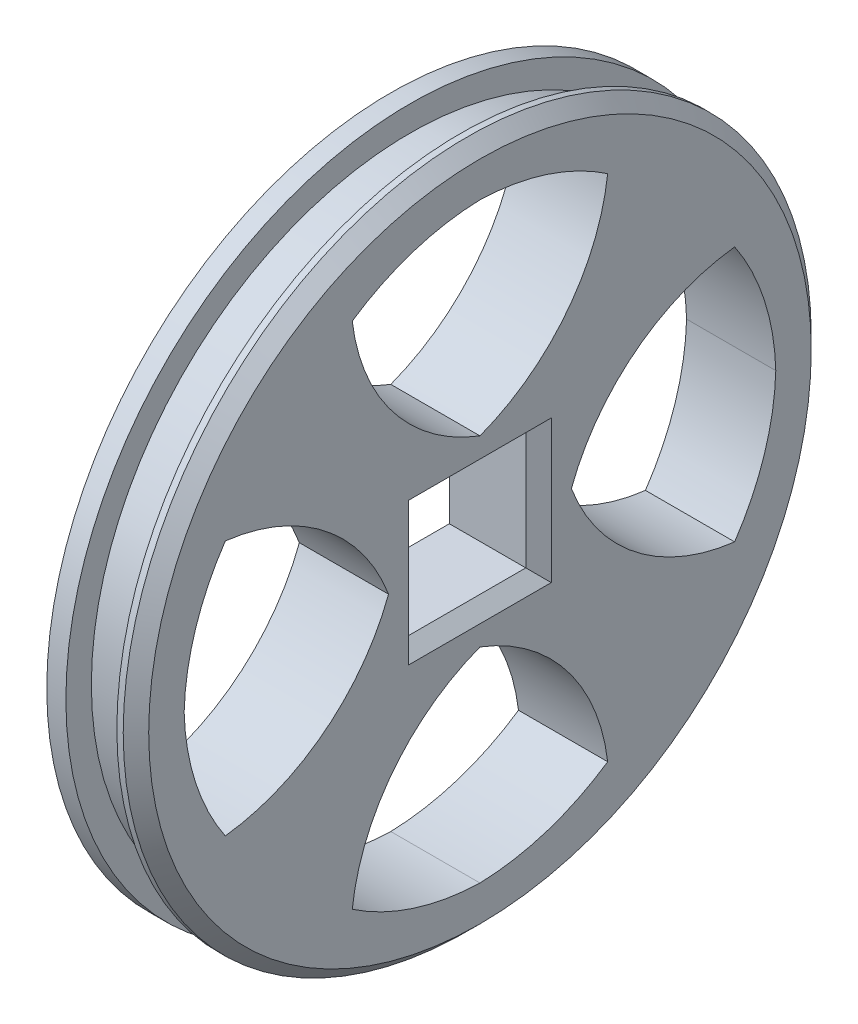
ISO-10303-21;
HEADER;
FILE_DESCRIPTION(('STEP AP214'),'2;1');
FILE_NAME('part.step','',(''),(''),'','','');
FILE_SCHEMA(('AUTOMOTIVE_DESIGN { 1 0 10303 214 1 1 1 1 }'));
ENDSEC;
DATA;
#1=APPLICATION_CONTEXT('core data for automotive mechanical design processes');
#2=APPLICATION_PROTOCOL_DEFINITION('international standard','automotive_design',2000,#1);
#3=PRODUCT_CONTEXT('',#1,'mechanical');
#4=PRODUCT('Part','Part','',(#3));
#5=PRODUCT_RELATED_PRODUCT_CATEGORY('part','',(#4));
#6=PRODUCT_DEFINITION_FORMATION('','',#4);
#7=PRODUCT_DEFINITION_CONTEXT('part definition',#1,'design');
#8=PRODUCT_DEFINITION('design','',#6,#7);
#9=PRODUCT_DEFINITION_SHAPE('','',#8);
#10=(LENGTH_UNIT() NAMED_UNIT(*) SI_UNIT(.MILLI.,.METRE.));
#11=(NAMED_UNIT(*) PLANE_ANGLE_UNIT() SI_UNIT($,.RADIAN.));
#12=(NAMED_UNIT(*) SI_UNIT($,.STERADIAN.) SOLID_ANGLE_UNIT());
#13=UNCERTAINTY_MEASURE_WITH_UNIT(LENGTH_MEASURE(1.E-05),#10,'distance_accuracy_value','');
#14=(GEOMETRIC_REPRESENTATION_CONTEXT(3) GLOBAL_UNCERTAINTY_ASSIGNED_CONTEXT((#13)) GLOBAL_UNIT_ASSIGNED_CONTEXT((#10,
#11,#12)) REPRESENTATION_CONTEXT('',''));
#15=CARTESIAN_POINT('',(0.,0.,0.));
#16=DIRECTION('',(0.,0.,1.));
#17=DIRECTION('',(1.,0.,0.));
#18=AXIS2_PLACEMENT_3D('',#15,#16,#17);
#19=CARTESIAN_POINT('',(1.75,0.,0.));
#20=DIRECTION('',(-1.,0.,0.));
#21=DIRECTION('',(0.,0.,1.));
#22=AXIS2_PLACEMENT_3D('',#19,#20,#21);
#23=CYLINDRICAL_SURFACE('',#22,13.5);
#24=CARTESIAN_POINT('',(-1.75,0.,0.));
#25=DIRECTION('',(1.,0.,0.));
#26=DIRECTION('',(0.,0.,-1.));
#27=AXIS2_PLACEMENT_3D('',#24,#25,#26);
#28=CIRCLE('',#27,13.5);
#29=CARTESIAN_POINT('',(-1.75,0.,-13.5));
#30=VERTEX_POINT('',#29);
#31=EDGE_CURVE('E343',#30,#30,#28,.T.);
#32=ORIENTED_EDGE('',*,*,#31,.T.);
#33=EDGE_LOOP('',(#32));
#34=FACE_BOUND('',#33,.T.);
#35=CARTESIAN_POINT('',(-1.,0.,0.));
#36=DIRECTION('',(1.,0.,0.));
#37=DIRECTION('',(0.,0.,-1.));
#38=AXIS2_PLACEMENT_3D('',#35,#36,#37);
#39=CIRCLE('',#38,13.5);
#40=CARTESIAN_POINT('',(-1.,0.,-13.5));
#41=VERTEX_POINT('',#40);
#42=EDGE_CURVE('E366',#41,#41,#39,.T.);
#43=ORIENTED_EDGE('',*,*,#42,.F.);
#44=EDGE_LOOP('',(#43));
#45=FACE_BOUND('',#44,.T.);
#46=ADVANCED_FACE('F35',(#34,#45),#23,.T.);
#47=CARTESIAN_POINT('',(1.75,0.,0.));
#48=DIRECTION('',(1.,0.,0.));
#49=DIRECTION('',(0.,0.,-1.));
#50=AXIS2_PLACEMENT_3D('',#47,#48,#49);
#51=PLANE('',#50);
#52=DIRECTION('',(0.,0.,1.));
#53=VECTOR('',#52,1.);
#54=CARTESIAN_POINT('',(1.75,-2.79809703885628,0.));
#55=LINE('',#54,#53);
#56=CARTESIAN_POINT('',(1.75,-2.79809703885628,-2.79809703885629));
#57=VERTEX_POINT('',#56);
#58=CARTESIAN_POINT('',(1.75,-2.79809703885628,2.79809703885628));
#59=VERTEX_POINT('',#58);
#60=EDGE_CURVE('E354',#57,#59,#55,.T.);
#61=ORIENTED_EDGE('',*,*,#60,.T.);
#62=DIRECTION('',(0.,1.,0.));
#63=VECTOR('',#62,1.);
#64=CARTESIAN_POINT('',(1.75,0.,2.79809703885628));
#65=LINE('',#64,#63);
#66=CARTESIAN_POINT('',(1.75,2.79809703885628,2.79809703885628));
#67=VERTEX_POINT('',#66);
#68=EDGE_CURVE('E356',#59,#67,#65,.T.);
#69=ORIENTED_EDGE('',*,*,#68,.T.);
#70=DIRECTION('',(0.,0.,-1.));
#71=VECTOR('',#70,1.);
#72=CARTESIAN_POINT('',(1.75,2.79809703885628,0.));
#73=LINE('',#72,#71);
#74=CARTESIAN_POINT('',(1.75,2.79809703885628,-2.79809703885629));
#75=VERTEX_POINT('',#74);
#76=EDGE_CURVE('E352',#67,#75,#73,.T.);
#77=ORIENTED_EDGE('',*,*,#76,.T.);
#78=DIRECTION('',(0.,-1.,0.));
#79=VECTOR('',#78,1.);
#80=CARTESIAN_POINT('',(1.75,0.,-2.79809703885629));
#81=LINE('',#80,#79);
#82=EDGE_CURVE('E350',#75,#57,#81,.T.);
#83=ORIENTED_EDGE('',*,*,#82,.T.);
#84=EDGE_LOOP('',(#61,#69,#77,#83));
#85=FACE_BOUND('',#84,.T.);
#86=CARTESIAN_POINT('',(1.75,0.,0.));
#87=DIRECTION('',(1.,0.,0.));
#88=DIRECTION('',(0.,0.,-1.));
#89=AXIS2_PLACEMENT_3D('',#86,#87,#88);
#90=CIRCLE('',#89,13.);
#91=CARTESIAN_POINT('',(1.75,0.,-13.));
#92=VERTEX_POINT('',#91);
#93=EDGE_CURVE('E347',#92,#92,#90,.T.);
#94=ORIENTED_EDGE('',*,*,#93,.T.);
#95=EDGE_LOOP('',(#94));
#96=FACE_BOUND('',#95,.T.);
#97=CARTESIAN_POINT('',(1.75,-2.21796156357521,-0.259109709954825));
#98=DIRECTION('',(1.,0.,0.));
#99=DIRECTION('',(0.,0.,1.));
#100=AXIS2_PLACEMENT_3D('',#97,#98,#99);
#101=CIRCLE('',#100,9.39432433543306);
#102=CARTESIAN_POINT('',(1.75,-9.99397715020798,5.01221946927066));
#103=VERTEX_POINT('',#102);
#104=CARTESIAN_POINT('',(1.75,-11.6087118998112,0.));
#105=VERTEX_POINT('',#104);
#106=EDGE_CURVE('E267',#103,#105,#101,.T.);
#107=ORIENTED_EDGE('',*,*,#106,.F.);
#108=CARTESIAN_POINT('',(1.75,-10.9187288878689,-2.77020242849163));
#109=DIRECTION('',(1.,0.,0.));
#110=DIRECTION('',(0.,0.,1.));
#111=AXIS2_PLACEMENT_3D('',#108,#109,#110);
#112=CIRCLE('',#111,7.8371714521935);
#113=CARTESIAN_POINT('',(1.75,-3.58747832086083,0.));
#114=VERTEX_POINT('',#113);
#115=EDGE_CURVE('E265',#114,#103,#112,.T.);
#116=ORIENTED_EDGE('',*,*,#115,.F.);
#117=CARTESIAN_POINT('',(1.75,-10.9187288878689,2.77020242849163));
#118=DIRECTION('',(1.,0.,0.));
#119=DIRECTION('',(0.,0.,-1.));
#120=AXIS2_PLACEMENT_3D('',#117,#118,#119);
#121=CIRCLE('',#120,7.8371714521935);
#122=CARTESIAN_POINT('',(1.75,-9.99397715020797,-5.01221946927065));
#123=VERTEX_POINT('',#122);
#124=EDGE_CURVE('E272',#123,#114,#121,.T.);
#125=ORIENTED_EDGE('',*,*,#124,.F.);
#126=CARTESIAN_POINT('',(1.75,-2.21796156357521,0.259109709954825));
#127=DIRECTION('',(1.,0.,0.));
#128=DIRECTION('',(0.,0.,-1.));
#129=AXIS2_PLACEMENT_3D('',#126,#127,#128);
#130=CIRCLE('',#129,9.39432433543306);
#131=EDGE_CURVE('E269',#105,#123,#130,.T.);
#132=ORIENTED_EDGE('',*,*,#131,.F.);
#133=EDGE_LOOP('',(#107,#116,#125,#132));
#134=FACE_BOUND('',#133,.T.);
#135=CARTESIAN_POINT('',(1.75,0.259109709954849,-2.2179615635752));
#136=DIRECTION('',(1.,0.,0.));
#137=DIRECTION('',(0.,-1.,0.));
#138=AXIS2_PLACEMENT_3D('',#135,#136,#137);
#139=CIRCLE('',#138,9.39432433543306);
#140=CARTESIAN_POINT('',(1.75,-5.01221946927055,-9.99397715020803));
#141=VERTEX_POINT('',#140);
#142=CARTESIAN_POINT('',(1.75,1.22028483767586E-13,-11.6087118998112));
#143=VERTEX_POINT('',#142);
#144=EDGE_CURVE('E237',#141,#143,#139,.T.);
#145=ORIENTED_EDGE('',*,*,#144,.F.);
#146=CARTESIAN_POINT('',(1.75,2.77020242849175,-10.9187288878689));
#147=DIRECTION('',(1.,0.,0.));
#148=DIRECTION('',(0.,-1.,0.));
#149=AXIS2_PLACEMENT_3D('',#146,#147,#148);
#150=CIRCLE('',#149,7.8371714521935);
#151=CARTESIAN_POINT('',(1.75,0.,-3.58747832086083));
#152=VERTEX_POINT('',#151);
#153=EDGE_CURVE('E235',#152,#141,#150,.T.);
#154=ORIENTED_EDGE('',*,*,#153,.F.);
#155=CARTESIAN_POINT('',(1.75,-2.77020242849152,-10.9187288878689));
#156=DIRECTION('',(1.,0.,0.));
#157=DIRECTION('',(0.,1.,0.));
#158=AXIS2_PLACEMENT_3D('',#155,#156,#157);
#159=CIRCLE('',#158,7.8371714521935);
#160=CARTESIAN_POINT('',(1.75,5.01221946927076,-9.99397715020792));
#161=VERTEX_POINT('',#160);
#162=EDGE_CURVE('E242',#161,#152,#159,.T.);
#163=ORIENTED_EDGE('',*,*,#162,.F.);
#164=CARTESIAN_POINT('',(1.75,-0.259109709954802,-2.21796156357521));
#165=DIRECTION('',(1.,0.,0.));
#166=DIRECTION('',(0.,1.,0.));
#167=AXIS2_PLACEMENT_3D('',#164,#165,#166);
#168=CIRCLE('',#167,9.39432433543306);
#169=EDGE_CURVE('E239',#143,#161,#168,.T.);
#170=ORIENTED_EDGE('',*,*,#169,.F.);
#171=EDGE_LOOP('',(#145,#154,#163,#170));
#172=FACE_BOUND('',#171,.T.);
#173=CARTESIAN_POINT('',(1.75,-0.259109709954833,2.2179615635752));
#174=DIRECTION('',(1.,0.,0.));
#175=DIRECTION('',(0.,1.,0.));
#176=AXIS2_PLACEMENT_3D('',#173,#174,#175);
#177=CIRCLE('',#176,9.39432433543306);
#178=CARTESIAN_POINT('',(1.75,5.01221946927062,9.99397715020799));
#179=VERTEX_POINT('',#178);
#180=CARTESIAN_POINT('',(1.75,0.,11.6087118998112));
#181=VERTEX_POINT('',#180);
#182=EDGE_CURVE('E297',#179,#181,#177,.T.);
#183=ORIENTED_EDGE('',*,*,#182,.F.);
#184=CARTESIAN_POINT('',(1.75,-2.77020242849167,10.9187288878689));
#185=DIRECTION('',(1.,0.,0.));
#186=DIRECTION('',(0.,1.,0.));
#187=AXIS2_PLACEMENT_3D('',#184,#185,#186);
#188=CIRCLE('',#187,7.8371714521935);
#189=CARTESIAN_POINT('',(1.75,0.,3.58747832086083));
#190=VERTEX_POINT('',#189);
#191=EDGE_CURVE('E295',#190,#179,#188,.T.);
#192=ORIENTED_EDGE('',*,*,#191,.F.);
#193=CARTESIAN_POINT('',(1.75,2.77020242849159,10.9187288878689));
#194=DIRECTION('',(1.,0.,0.));
#195=DIRECTION('',(0.,-1.,0.));
#196=AXIS2_PLACEMENT_3D('',#193,#194,#195);
#197=CIRCLE('',#196,7.8371714521935);
#198=CARTESIAN_POINT('',(1.75,-5.01221946927069,9.99397715020795));
#199=VERTEX_POINT('',#198);
#200=EDGE_CURVE('E302',#199,#190,#197,.T.);
#201=ORIENTED_EDGE('',*,*,#200,.F.);
#202=CARTESIAN_POINT('',(1.75,0.259109709954818,2.21796156357521));
#203=DIRECTION('',(1.,0.,0.));
#204=DIRECTION('',(0.,-1.,0.));
#205=AXIS2_PLACEMENT_3D('',#202,#203,#204);
#206=CIRCLE('',#205,9.39432433543306);
#207=EDGE_CURVE('E299',#181,#199,#206,.T.);
#208=ORIENTED_EDGE('',*,*,#207,.F.);
#209=EDGE_LOOP('',(#183,#192,#201,#208));
#210=FACE_BOUND('',#209,.T.);
#211=CARTESIAN_POINT('',(1.75,2.21796156357521,0.259109709954825));
#212=DIRECTION('',(1.,0.,0.));
#213=DIRECTION('',(0.,0.,-1.));
#214=AXIS2_PLACEMENT_3D('',#211,#212,#213);
#215=CIRCLE('',#214,9.39432433543306);
#216=CARTESIAN_POINT('',(1.75,9.99397715020798,-5.01221946927066));
#217=VERTEX_POINT('',#216);
#218=CARTESIAN_POINT('',(1.75,11.6087118998112,0.));
#219=VERTEX_POINT('',#218);
#220=EDGE_CURVE('E327',#217,#219,#215,.T.);
#221=ORIENTED_EDGE('',*,*,#220,.F.);
#222=CARTESIAN_POINT('',(1.75,10.9187288878689,2.77020242849163));
#223=DIRECTION('',(1.,0.,0.));
#224=DIRECTION('',(0.,0.,-1.));
#225=AXIS2_PLACEMENT_3D('',#222,#223,#224);
#226=CIRCLE('',#225,7.8371714521935);
#227=CARTESIAN_POINT('',(1.75,3.58747832086083,0.));
#228=VERTEX_POINT('',#227);
#229=EDGE_CURVE('E325',#228,#217,#226,.T.);
#230=ORIENTED_EDGE('',*,*,#229,.F.);
#231=CARTESIAN_POINT('',(1.75,10.9187288878689,-2.77020242849163));
#232=DIRECTION('',(1.,0.,0.));
#233=DIRECTION('',(0.,0.,1.));
#234=AXIS2_PLACEMENT_3D('',#231,#232,#233);
#235=CIRCLE('',#234,7.8371714521935);
#236=CARTESIAN_POINT('',(1.75,9.99397715020797,5.01221946927065));
#237=VERTEX_POINT('',#236);
#238=EDGE_CURVE('E332',#237,#228,#235,.T.);
#239=ORIENTED_EDGE('',*,*,#238,.F.);
#240=CARTESIAN_POINT('',(1.75,2.21796156357521,-0.259109709954825));
#241=DIRECTION('',(1.,0.,0.));
#242=DIRECTION('',(0.,0.,1.));
#243=AXIS2_PLACEMENT_3D('',#240,#241,#242);
#244=CIRCLE('',#243,9.39432433543306);
#245=EDGE_CURVE('E329',#219,#237,#244,.T.);
#246=ORIENTED_EDGE('',*,*,#245,.F.);
#247=EDGE_LOOP('',(#221,#230,#239,#246));
#248=FACE_BOUND('',#247,.T.);
#249=ADVANCED_FACE('F394',(#85,#96,#134,#172,#210,#248),#51,.T.);
#250=CARTESIAN_POINT('',(-1.75,0.,0.));
#251=DIRECTION('',(1.,0.,0.));
#252=DIRECTION('',(0.,0.,-1.));
#253=AXIS2_PLACEMENT_3D('',#250,#251,#252);
#254=PLANE('',#253);
#255=ORIENTED_EDGE('',*,*,#31,.F.);
#256=EDGE_LOOP('',(#255));
#257=FACE_BOUND('',#256,.T.);
#258=CARTESIAN_POINT('',(-1.75,10.9187288878689,2.77020242849163));
#259=DIRECTION('',(1.,0.,0.));
#260=DIRECTION('',(0.,0.,-1.));
#261=AXIS2_PLACEMENT_3D('',#258,#259,#260);
#262=CIRCLE('',#261,7.8371714521935);
#263=CARTESIAN_POINT('',(-1.75,3.58747832086083,0.));
#264=VERTEX_POINT('',#263);
#265=CARTESIAN_POINT('',(-1.75,9.99397715020798,-5.01221946927066));
#266=VERTEX_POINT('',#265);
#267=EDGE_CURVE('E313',#264,#266,#262,.T.);
#268=ORIENTED_EDGE('',*,*,#267,.T.);
#269=CARTESIAN_POINT('',(-1.75,2.21796156357521,0.259109709954825));
#270=DIRECTION('',(1.,0.,0.));
#271=DIRECTION('',(0.,0.,-1.));
#272=AXIS2_PLACEMENT_3D('',#269,#270,#271);
#273=CIRCLE('',#272,9.39432433543306);
#274=CARTESIAN_POINT('',(-1.75,11.6087118998112,0.));
#275=VERTEX_POINT('',#274);
#276=EDGE_CURVE('E316',#266,#275,#273,.T.);
#277=ORIENTED_EDGE('',*,*,#276,.T.);
#278=CARTESIAN_POINT('',(-1.75,2.21796156357521,-0.259109709954825));
#279=DIRECTION('',(1.,0.,0.));
#280=DIRECTION('',(0.,0.,1.));
#281=AXIS2_PLACEMENT_3D('',#278,#279,#280);
#282=CIRCLE('',#281,9.39432433543306);
#283=CARTESIAN_POINT('',(-1.75,9.99397715020797,5.01221946927065));
#284=VERTEX_POINT('',#283);
#285=EDGE_CURVE('E319',#275,#284,#282,.T.);
#286=ORIENTED_EDGE('',*,*,#285,.T.);
#287=CARTESIAN_POINT('',(-1.75,10.9187288878689,-2.77020242849163));
#288=DIRECTION('',(1.,0.,0.));
#289=DIRECTION('',(0.,0.,1.));
#290=AXIS2_PLACEMENT_3D('',#287,#288,#289);
#291=CIRCLE('',#290,7.8371714521935);
#292=EDGE_CURVE('E322',#284,#264,#291,.T.);
#293=ORIENTED_EDGE('',*,*,#292,.T.);
#294=EDGE_LOOP('',(#268,#277,#286,#293));
#295=FACE_BOUND('',#294,.T.);
#296=CARTESIAN_POINT('',(-1.75,-2.77020242849167,10.9187288878689));
#297=DIRECTION('',(1.,0.,0.));
#298=DIRECTION('',(0.,1.,0.));
#299=AXIS2_PLACEMENT_3D('',#296,#297,#298);
#300=CIRCLE('',#299,7.8371714521935);
#301=CARTESIAN_POINT('',(-1.75,0.,3.58747832086083));
#302=VERTEX_POINT('',#301);
#303=CARTESIAN_POINT('',(-1.75,5.01221946927062,9.99397715020799));
#304=VERTEX_POINT('',#303);
#305=EDGE_CURVE('E283',#302,#304,#300,.T.);
#306=ORIENTED_EDGE('',*,*,#305,.T.);
#307=CARTESIAN_POINT('',(-1.75,-0.259109709954833,2.2179615635752));
#308=DIRECTION('',(1.,0.,0.));
#309=DIRECTION('',(0.,1.,0.));
#310=AXIS2_PLACEMENT_3D('',#307,#308,#309);
#311=CIRCLE('',#310,9.39432433543306);
#312=CARTESIAN_POINT('',(-1.75,0.,11.6087118998112));
#313=VERTEX_POINT('',#312);
#314=EDGE_CURVE('E286',#304,#313,#311,.T.);
#315=ORIENTED_EDGE('',*,*,#314,.T.);
#316=CARTESIAN_POINT('',(-1.75,0.259109709954818,2.21796156357521));
#317=DIRECTION('',(1.,0.,0.));
#318=DIRECTION('',(0.,-1.,0.));
#319=AXIS2_PLACEMENT_3D('',#316,#317,#318);
#320=CIRCLE('',#319,9.39432433543306);
#321=CARTESIAN_POINT('',(-1.75,-5.01221946927069,9.99397715020795));
#322=VERTEX_POINT('',#321);
#323=EDGE_CURVE('E289',#313,#322,#320,.T.);
#324=ORIENTED_EDGE('',*,*,#323,.T.);
#325=CARTESIAN_POINT('',(-1.75,2.77020242849159,10.9187288878689));
#326=DIRECTION('',(1.,0.,0.));
#327=DIRECTION('',(0.,-1.,0.));
#328=AXIS2_PLACEMENT_3D('',#325,#326,#327);
#329=CIRCLE('',#328,7.8371714521935);
#330=EDGE_CURVE('E292',#322,#302,#329,.T.);
#331=ORIENTED_EDGE('',*,*,#330,.T.);
#332=EDGE_LOOP('',(#306,#315,#324,#331));
#333=FACE_BOUND('',#332,.T.);
#334=CARTESIAN_POINT('',(-1.75,2.77020242849175,-10.9187288878689));
#335=DIRECTION('',(1.,0.,0.));
#336=DIRECTION('',(0.,-1.,0.));
#337=AXIS2_PLACEMENT_3D('',#334,#335,#336);
#338=CIRCLE('',#337,7.8371714521935);
#339=CARTESIAN_POINT('',(-1.75,0.,-3.58747832086083));
#340=VERTEX_POINT('',#339);
#341=CARTESIAN_POINT('',(-1.75,-5.01221946927055,-9.99397715020803));
#342=VERTEX_POINT('',#341);
#343=EDGE_CURVE('E196',#340,#342,#338,.T.);
#344=ORIENTED_EDGE('',*,*,#343,.T.);
#345=CARTESIAN_POINT('',(-1.75,0.259109709954849,-2.2179615635752));
#346=DIRECTION('',(1.,0.,0.));
#347=DIRECTION('',(0.,-1.,0.));
#348=AXIS2_PLACEMENT_3D('',#345,#346,#347);
#349=CIRCLE('',#348,9.39432433543306);
#350=CARTESIAN_POINT('',(-1.75,1.22028483767586E-13,-11.6087118998112));
#351=VERTEX_POINT('',#350);
#352=EDGE_CURVE('E226',#342,#351,#349,.T.);
#353=ORIENTED_EDGE('',*,*,#352,.T.);
#354=CARTESIAN_POINT('',(-1.75,-0.259109709954802,-2.21796156357521));
#355=DIRECTION('',(1.,0.,0.));
#356=DIRECTION('',(0.,1.,0.));
#357=AXIS2_PLACEMENT_3D('',#354,#355,#356);
#358=CIRCLE('',#357,9.39432433543306);
#359=CARTESIAN_POINT('',(-1.75,5.01221946927076,-9.99397715020792));
#360=VERTEX_POINT('',#359);
#361=EDGE_CURVE('E229',#351,#360,#358,.T.);
#362=ORIENTED_EDGE('',*,*,#361,.T.);
#363=CARTESIAN_POINT('',(-1.75,-2.77020242849152,-10.9187288878689));
#364=DIRECTION('',(1.,0.,0.));
#365=DIRECTION('',(0.,1.,0.));
#366=AXIS2_PLACEMENT_3D('',#363,#364,#365);
#367=CIRCLE('',#366,7.8371714521935);
#368=EDGE_CURVE('E232',#360,#340,#367,.T.);
#369=ORIENTED_EDGE('',*,*,#368,.T.);
#370=EDGE_LOOP('',(#344,#353,#362,#369));
#371=FACE_BOUND('',#370,.T.);
#372=CARTESIAN_POINT('',(-1.75,-10.9187288878689,-2.77020242849163));
#373=DIRECTION('',(1.,0.,0.));
#374=DIRECTION('',(0.,0.,1.));
#375=AXIS2_PLACEMENT_3D('',#372,#373,#374);
#376=CIRCLE('',#375,7.8371714521935);
#377=CARTESIAN_POINT('',(-1.75,-3.58747832086083,0.));
#378=VERTEX_POINT('',#377);
#379=CARTESIAN_POINT('',(-1.75,-9.99397715020798,5.01221946927066));
#380=VERTEX_POINT('',#379);
#381=EDGE_CURVE('E253',#378,#380,#376,.T.);
#382=ORIENTED_EDGE('',*,*,#381,.T.);
#383=CARTESIAN_POINT('',(-1.75,-2.21796156357521,-0.259109709954825));
#384=DIRECTION('',(1.,0.,0.));
#385=DIRECTION('',(0.,0.,1.));
#386=AXIS2_PLACEMENT_3D('',#383,#384,#385);
#387=CIRCLE('',#386,9.39432433543306);
#388=CARTESIAN_POINT('',(-1.75,-11.6087118998112,0.));
#389=VERTEX_POINT('',#388);
#390=EDGE_CURVE('E256',#380,#389,#387,.T.);
#391=ORIENTED_EDGE('',*,*,#390,.T.);
#392=CARTESIAN_POINT('',(-1.75,-2.21796156357521,0.259109709954825));
#393=DIRECTION('',(1.,0.,0.));
#394=DIRECTION('',(0.,0.,-1.));
#395=AXIS2_PLACEMENT_3D('',#392,#393,#394);
#396=CIRCLE('',#395,9.39432433543306);
#397=CARTESIAN_POINT('',(-1.75,-9.99397715020797,-5.01221946927065));
#398=VERTEX_POINT('',#397);
#399=EDGE_CURVE('E259',#389,#398,#396,.T.);
#400=ORIENTED_EDGE('',*,*,#399,.T.);
#401=CARTESIAN_POINT('',(-1.75,-10.9187288878689,2.77020242849163));
#402=DIRECTION('',(1.,0.,0.));
#403=DIRECTION('',(0.,0.,-1.));
#404=AXIS2_PLACEMENT_3D('',#401,#402,#403);
#405=CIRCLE('',#404,7.8371714521935);
#406=EDGE_CURVE('E262',#398,#378,#405,.T.);
#407=ORIENTED_EDGE('',*,*,#406,.T.);
#408=EDGE_LOOP('',(#382,#391,#400,#407));
#409=FACE_BOUND('',#408,.T.);
#410=DIRECTION('',(0.,-1.,0.));
#411=VECTOR('',#410,1.);
#412=CARTESIAN_POINT('',(-1.75,-2.29809703885628,2.29809703885628));
#413=LINE('',#412,#411);
#414=CARTESIAN_POINT('',(-1.75,2.29809703885628,2.29809703885628));
#415=VERTEX_POINT('',#414);
#416=CARTESIAN_POINT('',(-1.75,-2.29809703885628,2.29809703885628));
#417=VERTEX_POINT('',#416);
#418=EDGE_CURVE('E192',#415,#417,#413,.T.);
#419=ORIENTED_EDGE('',*,*,#418,.T.);
#420=DIRECTION('',(0.,0.,-1.));
#421=VECTOR('',#420,1.);
#422=CARTESIAN_POINT('',(-1.75,-2.29809703885628,-2.29809703885628));
#423=LINE('',#422,#421);
#424=CARTESIAN_POINT('',(-1.75,-2.29809703885628,-2.29809703885628));
#425=VERTEX_POINT('',#424);
#426=EDGE_CURVE('E200',#417,#425,#423,.T.);
#427=ORIENTED_EDGE('',*,*,#426,.T.);
#428=DIRECTION('',(0.,1.,0.));
#429=VECTOR('',#428,1.);
#430=CARTESIAN_POINT('',(-1.75,-2.29809703885628,-2.29809703885628));
#431=LINE('',#430,#429);
#432=CARTESIAN_POINT('',(-1.75,2.29809703885628,-2.29809703885628));
#433=VERTEX_POINT('',#432);
#434=EDGE_CURVE('E205',#425,#433,#431,.T.);
#435=ORIENTED_EDGE('',*,*,#434,.T.);
#436=DIRECTION('',(0.,0.,1.));
#437=VECTOR('',#436,1.);
#438=CARTESIAN_POINT('',(-1.75,2.29809703885628,-2.29809703885628));
#439=LINE('',#438,#437);
#440=EDGE_CURVE('E209',#433,#415,#439,.T.);
#441=ORIENTED_EDGE('',*,*,#440,.T.);
#442=EDGE_LOOP('',(#419,#427,#435,#441));
#443=FACE_BOUND('',#442,.T.);
#444=ADVANCED_FACE('F207',(#257,#295,#333,#371,#409,#443),#254,.F.);
#445=CARTESIAN_POINT('',(1.,0.,0.));
#446=DIRECTION('',(1.,0.,0.));
#447=DIRECTION('',(0.,0.,-1.));
#448=AXIS2_PLACEMENT_3D('',#445,#446,#447);
#449=CIRCLE('',#448,13.5);
#450=CARTESIAN_POINT('',(1.,0.,-13.5));
#451=VERTEX_POINT('',#450);
#452=EDGE_CURVE('E214',#451,#451,#449,.T.);
#453=ORIENTED_EDGE('',*,*,#452,.T.);
#454=EDGE_LOOP('',(#453));
#455=FACE_BOUND('',#454,.T.);
#456=CARTESIAN_POINT('',(1.24999999999999,0.,0.));
#457=DIRECTION('',(1.,0.,0.));
#458=DIRECTION('',(0.,0.,-1.));
#459=AXIS2_PLACEMENT_3D('',#456,#457,#458);
#460=CIRCLE('',#459,13.5);
#461=CARTESIAN_POINT('',(1.24999999999999,0.,-13.5));
#462=VERTEX_POINT('',#461);
#463=EDGE_CURVE('E11',#462,#462,#460,.F.);
#464=ORIENTED_EDGE('',*,*,#463,.T.);
#465=EDGE_LOOP('',(#464));
#466=FACE_BOUND('',#465,.T.);
#467=ADVANCED_FACE('F397',(#455,#466),#23,.T.);
#468=CARTESIAN_POINT('',(1.75,10.9187288878689,2.77020242849163));
#469=DIRECTION('',(-1.,0.,0.));
#470=DIRECTION('',(0.,0.,1.));
#471=AXIS2_PLACEMENT_3D('',#468,#469,#470);
#472=CYLINDRICAL_SURFACE('',#471,7.8371714521935);
#473=DIRECTION('',(-1.,0.,0.));
#474=VECTOR('',#473,1.);
#475=CARTESIAN_POINT('',(1.75,3.58747832086083,0.));
#476=LINE('',#475,#474);
#477=EDGE_CURVE('E334',#228,#264,#476,.T.);
#478=ORIENTED_EDGE('',*,*,#477,.F.);
#479=ORIENTED_EDGE('',*,*,#229,.T.);
#480=DIRECTION('',(-1.,0.,0.));
#481=VECTOR('',#480,1.);
#482=CARTESIAN_POINT('',(1.75,9.99397715020798,-5.01221946927066));
#483=LINE('',#482,#481);
#484=EDGE_CURVE('E341',#217,#266,#483,.T.);
#485=ORIENTED_EDGE('',*,*,#484,.T.);
#486=ORIENTED_EDGE('',*,*,#267,.F.);
#487=EDGE_LOOP('',(#478,#479,#485,#486));
#488=FACE_BOUND('',#487,.T.);
#489=ADVANCED_FACE('F407',(#488),#472,.F.);
#490=CARTESIAN_POINT('',(1.75,2.21796156357521,0.259109709954825));
#491=DIRECTION('',(-1.,0.,0.));
#492=DIRECTION('',(0.,0.,1.));
#493=AXIS2_PLACEMENT_3D('',#490,#491,#492);
#494=CYLINDRICAL_SURFACE('',#493,9.39432433543306);
#495=ORIENTED_EDGE('',*,*,#484,.F.);
#496=ORIENTED_EDGE('',*,*,#220,.T.);
#497=DIRECTION('',(-1.,0.,0.));
#498=VECTOR('',#497,1.);
#499=CARTESIAN_POINT('',(1.75,11.6087118998112,0.));
#500=LINE('',#499,#498);
#501=EDGE_CURVE('E339',#219,#275,#500,.T.);
#502=ORIENTED_EDGE('',*,*,#501,.T.);
#503=ORIENTED_EDGE('',*,*,#276,.F.);
#504=EDGE_LOOP('',(#495,#496,#502,#503));
#505=FACE_BOUND('',#504,.T.);
#506=ADVANCED_FACE('F413',(#505),#494,.F.);
#507=CARTESIAN_POINT('',(1.75,2.21796156357521,-0.259109709954825));
#508=DIRECTION('',(-1.,0.,0.));
#509=DIRECTION('',(0.,0.,1.));
#510=AXIS2_PLACEMENT_3D('',#507,#508,#509);
#511=CYLINDRICAL_SURFACE('',#510,9.39432433543306);
#512=ORIENTED_EDGE('',*,*,#501,.F.);
#513=ORIENTED_EDGE('',*,*,#245,.T.);
#514=DIRECTION('',(-1.,0.,0.));
#515=VECTOR('',#514,1.);
#516=CARTESIAN_POINT('',(1.75,9.99397715020797,5.01221946927065));
#517=LINE('',#516,#515);
#518=EDGE_CURVE('E337',#237,#284,#517,.T.);
#519=ORIENTED_EDGE('',*,*,#518,.T.);
#520=ORIENTED_EDGE('',*,*,#285,.F.);
#521=EDGE_LOOP('',(#512,#513,#519,#520));
#522=FACE_BOUND('',#521,.T.);
#523=ADVANCED_FACE('F451',(#522),#511,.F.);
#524=CARTESIAN_POINT('',(1.75,10.9187288878689,-2.77020242849163));
#525=DIRECTION('',(-1.,0.,0.));
#526=DIRECTION('',(0.,0.,1.));
#527=AXIS2_PLACEMENT_3D('',#524,#525,#526);
#528=CYLINDRICAL_SURFACE('',#527,7.8371714521935);
#529=ORIENTED_EDGE('',*,*,#518,.F.);
#530=ORIENTED_EDGE('',*,*,#238,.T.);
#531=ORIENTED_EDGE('',*,*,#477,.T.);
#532=ORIENTED_EDGE('',*,*,#292,.F.);
#533=EDGE_LOOP('',(#529,#530,#531,#532));
#534=FACE_BOUND('',#533,.T.);
#535=ADVANCED_FACE('F457',(#534),#528,.F.);
#536=CARTESIAN_POINT('',(1.75,-2.77020242849167,10.9187288878689));
#537=DIRECTION('',(-1.,0.,0.));
#538=DIRECTION('',(0.,0.,1.));
#539=AXIS2_PLACEMENT_3D('',#536,#537,#538);
#540=CYLINDRICAL_SURFACE('',#539,7.8371714521935);
#541=DIRECTION('',(-1.,0.,0.));
#542=VECTOR('',#541,1.);
#543=CARTESIAN_POINT('',(1.75,0.,3.58747832086083));
#544=LINE('',#543,#542);
#545=EDGE_CURVE('E304',#190,#302,#544,.T.);
#546=ORIENTED_EDGE('',*,*,#545,.F.);
#547=ORIENTED_EDGE('',*,*,#191,.T.);
#548=DIRECTION('',(-1.,0.,0.));
#549=VECTOR('',#548,1.);
#550=CARTESIAN_POINT('',(1.75,5.01221946927062,9.99397715020799));
#551=LINE('',#550,#549);
#552=EDGE_CURVE('E311',#179,#304,#551,.T.);
#553=ORIENTED_EDGE('',*,*,#552,.T.);
#554=ORIENTED_EDGE('',*,*,#305,.F.);
#555=EDGE_LOOP('',(#546,#547,#553,#554));
#556=FACE_BOUND('',#555,.T.);
#557=ADVANCED_FACE('F459',(#556),#540,.F.);
#558=CARTESIAN_POINT('',(1.75,-0.259109709954833,2.2179615635752));
#559=DIRECTION('',(-1.,0.,0.));
#560=DIRECTION('',(0.,0.,1.));
#561=AXIS2_PLACEMENT_3D('',#558,#559,#560);
#562=CYLINDRICAL_SURFACE('',#561,9.39432433543306);
#563=ORIENTED_EDGE('',*,*,#552,.F.);
#564=ORIENTED_EDGE('',*,*,#182,.T.);
#565=DIRECTION('',(-1.,0.,0.));
#566=VECTOR('',#565,1.);
#567=CARTESIAN_POINT('',(1.75,0.,11.6087118998112));
#568=LINE('',#567,#566);
#569=EDGE_CURVE('E309',#181,#313,#568,.T.);
#570=ORIENTED_EDGE('',*,*,#569,.T.);
#571=ORIENTED_EDGE('',*,*,#314,.F.);
#572=EDGE_LOOP('',(#563,#564,#570,#571));
#573=FACE_BOUND('',#572,.T.);
#574=ADVANCED_FACE('F465',(#573),#562,.F.);
#575=CARTESIAN_POINT('',(1.75,0.259109709954818,2.21796156357521));
#576=DIRECTION('',(-1.,0.,0.));
#577=DIRECTION('',(0.,0.,1.));
#578=AXIS2_PLACEMENT_3D('',#575,#576,#577);
#579=CYLINDRICAL_SURFACE('',#578,9.39432433543306);
#580=ORIENTED_EDGE('',*,*,#569,.F.);
#581=ORIENTED_EDGE('',*,*,#207,.T.);
#582=DIRECTION('',(-1.,0.,0.));
#583=VECTOR('',#582,1.);
#584=CARTESIAN_POINT('',(1.75,-5.01221946927069,9.99397715020795));
#585=LINE('',#584,#583);
#586=EDGE_CURVE('E307',#199,#322,#585,.T.);
#587=ORIENTED_EDGE('',*,*,#586,.T.);
#588=ORIENTED_EDGE('',*,*,#323,.F.);
#589=EDGE_LOOP('',(#580,#581,#587,#588));
#590=FACE_BOUND('',#589,.T.);
#591=ADVANCED_FACE('F499',(#590),#579,.F.);
#592=CARTESIAN_POINT('',(1.75,2.77020242849159,10.9187288878689));
#593=DIRECTION('',(-1.,0.,0.));
#594=DIRECTION('',(0.,0.,1.));
#595=AXIS2_PLACEMENT_3D('',#592,#593,#594);
#596=CYLINDRICAL_SURFACE('',#595,7.8371714521935);
#597=ORIENTED_EDGE('',*,*,#586,.F.);
#598=ORIENTED_EDGE('',*,*,#200,.T.);
#599=ORIENTED_EDGE('',*,*,#545,.T.);
#600=ORIENTED_EDGE('',*,*,#330,.F.);
#601=EDGE_LOOP('',(#597,#598,#599,#600));
#602=FACE_BOUND('',#601,.T.);
#603=ADVANCED_FACE('F508',(#602),#596,.F.);
#604=CARTESIAN_POINT('',(1.75,2.77020242849175,-10.9187288878689));
#605=DIRECTION('',(-1.,0.,0.));
#606=DIRECTION('',(0.,0.,1.));
#607=AXIS2_PLACEMENT_3D('',#604,#605,#606);
#608=CYLINDRICAL_SURFACE('',#607,7.8371714521935);
#609=DIRECTION('',(-1.,0.,0.));
#610=VECTOR('',#609,1.);
#611=CARTESIAN_POINT('',(1.75,0.,-3.58747832086083));
#612=LINE('',#611,#610);
#613=EDGE_CURVE('E244',#152,#340,#612,.T.);
#614=ORIENTED_EDGE('',*,*,#613,.F.);
#615=ORIENTED_EDGE('',*,*,#153,.T.);
#616=DIRECTION('',(-1.,0.,0.));
#617=VECTOR('',#616,1.);
#618=CARTESIAN_POINT('',(1.75,-5.01221946927055,-9.99397715020803));
#619=LINE('',#618,#617);
#620=EDGE_CURVE('E251',#141,#342,#619,.T.);
#621=ORIENTED_EDGE('',*,*,#620,.T.);
#622=ORIENTED_EDGE('',*,*,#343,.F.);
#623=EDGE_LOOP('',(#614,#615,#621,#622));
#624=FACE_BOUND('',#623,.T.);
#625=ADVANCED_FACE('F518',(#624),#608,.F.);
#626=CARTESIAN_POINT('',(1.75,0.259109709954849,-2.2179615635752));
#627=DIRECTION('',(-1.,0.,0.));
#628=DIRECTION('',(0.,0.,1.));
#629=AXIS2_PLACEMENT_3D('',#626,#627,#628);
#630=CYLINDRICAL_SURFACE('',#629,9.39432433543306);
#631=ORIENTED_EDGE('',*,*,#620,.F.);
#632=ORIENTED_EDGE('',*,*,#144,.T.);
#633=DIRECTION('',(-1.,0.,0.));
#634=VECTOR('',#633,1.);
#635=CARTESIAN_POINT('',(1.75,1.22028483767586E-13,-11.6087118998112));
#636=LINE('',#635,#634);
#637=EDGE_CURVE('E249',#143,#351,#636,.T.);
#638=ORIENTED_EDGE('',*,*,#637,.T.);
#639=ORIENTED_EDGE('',*,*,#352,.F.);
#640=EDGE_LOOP('',(#631,#632,#638,#639));
#641=FACE_BOUND('',#640,.T.);
#642=ADVANCED_FACE('F528',(#641),#630,.F.);
#643=CARTESIAN_POINT('',(1.75,-0.259109709954802,-2.21796156357521));
#644=DIRECTION('',(-1.,0.,0.));
#645=DIRECTION('',(0.,0.,1.));
#646=AXIS2_PLACEMENT_3D('',#643,#644,#645);
#647=CYLINDRICAL_SURFACE('',#646,9.39432433543306);
#648=ORIENTED_EDGE('',*,*,#637,.F.);
#649=ORIENTED_EDGE('',*,*,#169,.T.);
#650=DIRECTION('',(-1.,0.,0.));
#651=VECTOR('',#650,1.);
#652=CARTESIAN_POINT('',(1.75,5.01221946927076,-9.99397715020792));
#653=LINE('',#652,#651);
#654=EDGE_CURVE('E247',#161,#360,#653,.T.);
#655=ORIENTED_EDGE('',*,*,#654,.T.);
#656=ORIENTED_EDGE('',*,*,#361,.F.);
#657=EDGE_LOOP('',(#648,#649,#655,#656));
#658=FACE_BOUND('',#657,.T.);
#659=ADVANCED_FACE('F538',(#658),#647,.F.);
#660=CARTESIAN_POINT('',(1.75,-2.77020242849152,-10.9187288878689));
#661=DIRECTION('',(-1.,0.,0.));
#662=DIRECTION('',(0.,0.,1.));
#663=AXIS2_PLACEMENT_3D('',#660,#661,#662);
#664=CYLINDRICAL_SURFACE('',#663,7.8371714521935);
#665=ORIENTED_EDGE('',*,*,#654,.F.);
#666=ORIENTED_EDGE('',*,*,#162,.T.);
#667=ORIENTED_EDGE('',*,*,#613,.T.);
#668=ORIENTED_EDGE('',*,*,#368,.F.);
#669=EDGE_LOOP('',(#665,#666,#667,#668));
#670=FACE_BOUND('',#669,.T.);
#671=ADVANCED_FACE('F548',(#670),#664,.F.);
#672=CARTESIAN_POINT('',(1.75,-10.9187288878689,-2.77020242849163));
#673=DIRECTION('',(-1.,0.,0.));
#674=DIRECTION('',(0.,0.,1.));
#675=AXIS2_PLACEMENT_3D('',#672,#673,#674);
#676=CYLINDRICAL_SURFACE('',#675,7.8371714521935);
#677=DIRECTION('',(-1.,0.,0.));
#678=VECTOR('',#677,1.);
#679=CARTESIAN_POINT('',(1.75,-3.58747832086083,0.));
#680=LINE('',#679,#678);
#681=EDGE_CURVE('E274',#114,#378,#680,.T.);
#682=ORIENTED_EDGE('',*,*,#681,.F.);
#683=ORIENTED_EDGE('',*,*,#115,.T.);
#684=DIRECTION('',(-1.,0.,0.));
#685=VECTOR('',#684,1.);
#686=CARTESIAN_POINT('',(1.75,-9.99397715020798,5.01221946927066));
#687=LINE('',#686,#685);
#688=EDGE_CURVE('E281',#103,#380,#687,.T.);
#689=ORIENTED_EDGE('',*,*,#688,.T.);
#690=ORIENTED_EDGE('',*,*,#381,.F.);
#691=EDGE_LOOP('',(#682,#683,#689,#690));
#692=FACE_BOUND('',#691,.T.);
#693=ADVANCED_FACE('F558',(#692),#676,.F.);
#694=CARTESIAN_POINT('',(1.75,-2.21796156357521,-0.259109709954825));
#695=DIRECTION('',(-1.,0.,0.));
#696=DIRECTION('',(0.,0.,1.));
#697=AXIS2_PLACEMENT_3D('',#694,#695,#696);
#698=CYLINDRICAL_SURFACE('',#697,9.39432433543306);
#699=ORIENTED_EDGE('',*,*,#688,.F.);
#700=ORIENTED_EDGE('',*,*,#106,.T.);
#701=DIRECTION('',(-1.,0.,0.));
#702=VECTOR('',#701,1.);
#703=CARTESIAN_POINT('',(1.75,-11.6087118998112,0.));
#704=LINE('',#703,#702);
#705=EDGE_CURVE('E279',#105,#389,#704,.T.);
#706=ORIENTED_EDGE('',*,*,#705,.T.);
#707=ORIENTED_EDGE('',*,*,#390,.F.);
#708=EDGE_LOOP('',(#699,#700,#706,#707));
#709=FACE_BOUND('',#708,.T.);
#710=ADVANCED_FACE('F568',(#709),#698,.F.);
#711=CARTESIAN_POINT('',(1.75,-2.21796156357521,0.259109709954825));
#712=DIRECTION('',(-1.,0.,0.));
#713=DIRECTION('',(0.,0.,1.));
#714=AXIS2_PLACEMENT_3D('',#711,#712,#713);
#715=CYLINDRICAL_SURFACE('',#714,9.39432433543306);
#716=ORIENTED_EDGE('',*,*,#705,.F.);
#717=ORIENTED_EDGE('',*,*,#131,.T.);
#718=DIRECTION('',(-1.,0.,0.));
#719=VECTOR('',#718,1.);
#720=CARTESIAN_POINT('',(1.75,-9.99397715020797,-5.01221946927065));
#721=LINE('',#720,#719);
#722=EDGE_CURVE('E277',#123,#398,#721,.T.);
#723=ORIENTED_EDGE('',*,*,#722,.T.);
#724=ORIENTED_EDGE('',*,*,#399,.F.);
#725=EDGE_LOOP('',(#716,#717,#723,#724));
#726=FACE_BOUND('',#725,.T.);
#727=ADVANCED_FACE('F578',(#726),#715,.F.);
#728=CARTESIAN_POINT('',(1.75,-10.9187288878689,2.77020242849163));
#729=DIRECTION('',(-1.,0.,0.));
#730=DIRECTION('',(0.,0.,1.));
#731=AXIS2_PLACEMENT_3D('',#728,#729,#730);
#732=CYLINDRICAL_SURFACE('',#731,7.8371714521935);
#733=ORIENTED_EDGE('',*,*,#722,.F.);
#734=ORIENTED_EDGE('',*,*,#124,.T.);
#735=ORIENTED_EDGE('',*,*,#681,.T.);
#736=ORIENTED_EDGE('',*,*,#406,.F.);
#737=EDGE_LOOP('',(#733,#734,#735,#736));
#738=FACE_BOUND('',#737,.T.);
#739=ADVANCED_FACE('F588',(#738),#732,.F.);
#740=CARTESIAN_POINT('',(1.75,-2.29809703885628,2.29809703885628));
#741=DIRECTION('',(0.,0.,-1.));
#742=DIRECTION('',(-1.,0.,0.));
#743=AXIS2_PLACEMENT_3D('',#740,#741,#742);
#744=PLANE('',#743);
#745=DIRECTION('',(-1.,0.,0.));
#746=VECTOR('',#745,1.);
#747=CARTESIAN_POINT('',(1.75,2.29809703885628,2.29809703885628));
#748=LINE('',#747,#746);
#749=CARTESIAN_POINT('',(1.25,2.29809703885628,2.29809703885628));
#750=VERTEX_POINT('',#749);
#751=EDGE_CURVE('E219',#750,#415,#748,.T.);
#752=ORIENTED_EDGE('',*,*,#751,.F.);
#753=DIRECTION('',(0.,-1.,0.));
#754=VECTOR('',#753,1.);
#755=CARTESIAN_POINT('',(1.25,-2.29809703885628,2.29809703885628));
#756=LINE('',#755,#754);
#757=CARTESIAN_POINT('',(1.25,-2.29809703885628,2.29809703885628));
#758=VERTEX_POINT('',#757);
#759=EDGE_CURVE('E195',#750,#758,#756,.T.);
#760=ORIENTED_EDGE('',*,*,#759,.T.);
#761=DIRECTION('',(-1.,0.,0.));
#762=VECTOR('',#761,1.);
#763=CARTESIAN_POINT('',(1.75,-2.29809703885628,2.29809703885628));
#764=LINE('',#763,#762);
#765=EDGE_CURVE('E187',#758,#417,#764,.T.);
#766=ORIENTED_EDGE('',*,*,#765,.T.);
#767=ORIENTED_EDGE('',*,*,#418,.F.);
#768=EDGE_LOOP('',(#752,#760,#766,#767));
#769=FACE_BOUND('',#768,.T.);
#770=ADVANCED_FACE('F190',(#769),#744,.T.);
#771=CARTESIAN_POINT('',(1.75,-2.29809703885628,-2.29809703885628));
#772=DIRECTION('',(0.,1.,0.));
#773=DIRECTION('',(0.,0.,1.));
#774=AXIS2_PLACEMENT_3D('',#771,#772,#773);
#775=PLANE('',#774);
#776=ORIENTED_EDGE('',*,*,#765,.F.);
#777=DIRECTION('',(0.,0.,-1.));
#778=VECTOR('',#777,1.);
#779=CARTESIAN_POINT('',(1.25,-2.29809703885628,-2.29809703885628));
#780=LINE('',#779,#778);
#781=CARTESIAN_POINT('',(1.25,-2.29809703885628,-2.29809703885628));
#782=VERTEX_POINT('',#781);
#783=EDGE_CURVE('E60',#758,#782,#780,.T.);
#784=ORIENTED_EDGE('',*,*,#783,.T.);
#785=DIRECTION('',(-1.,0.,0.));
#786=VECTOR('',#785,1.);
#787=CARTESIAN_POINT('',(1.75,-2.29809703885628,-2.29809703885628));
#788=LINE('',#787,#786);
#789=EDGE_CURVE('E197',#782,#425,#788,.T.);
#790=ORIENTED_EDGE('',*,*,#789,.T.);
#791=ORIENTED_EDGE('',*,*,#426,.F.);
#792=EDGE_LOOP('',(#776,#784,#790,#791));
#793=FACE_BOUND('',#792,.T.);
#794=ADVANCED_FACE('F201',(#793),#775,.T.);
#795=CARTESIAN_POINT('',(1.75,-2.29809703885628,-2.29809703885628));
#796=DIRECTION('',(0.,0.,1.));
#797=DIRECTION('',(1.,0.,0.));
#798=AXIS2_PLACEMENT_3D('',#795,#796,#797);
#799=PLANE('',#798);
#800=ORIENTED_EDGE('',*,*,#789,.F.);
#801=DIRECTION('',(0.,1.,0.));
#802=VECTOR('',#801,1.);
#803=CARTESIAN_POINT('',(1.25,-2.29809703885628,-2.29809703885628));
#804=LINE('',#803,#802);
#805=CARTESIAN_POINT('',(1.25,2.29809703885628,-2.29809703885628));
#806=VERTEX_POINT('',#805);
#807=EDGE_CURVE('E45',#782,#806,#804,.T.);
#808=ORIENTED_EDGE('',*,*,#807,.T.);
#809=DIRECTION('',(-1.,0.,0.));
#810=VECTOR('',#809,1.);
#811=CARTESIAN_POINT('',(1.75,2.29809703885628,-2.29809703885628));
#812=LINE('',#811,#810);
#813=EDGE_CURVE('E221',#806,#433,#812,.T.);
#814=ORIENTED_EDGE('',*,*,#813,.T.);
#815=ORIENTED_EDGE('',*,*,#434,.F.);
#816=EDGE_LOOP('',(#800,#808,#814,#815));
#817=FACE_BOUND('',#816,.T.);
#818=ADVANCED_FACE('F384',(#817),#799,.T.);
#819=CARTESIAN_POINT('',(1.75,2.29809703885628,-2.29809703885628));
#820=DIRECTION('',(0.,-1.,0.));
#821=DIRECTION('',(0.,0.,-1.));
#822=AXIS2_PLACEMENT_3D('',#819,#820,#821);
#823=PLANE('',#822);
#824=ORIENTED_EDGE('',*,*,#813,.F.);
#825=DIRECTION('',(0.,0.,1.));
#826=VECTOR('',#825,1.);
#827=CARTESIAN_POINT('',(1.25,2.29809703885628,-2.29809703885628));
#828=LINE('',#827,#826);
#829=EDGE_CURVE('E360',#806,#750,#828,.T.);
#830=ORIENTED_EDGE('',*,*,#829,.T.);
#831=ORIENTED_EDGE('',*,*,#751,.T.);
#832=ORIENTED_EDGE('',*,*,#440,.F.);
#833=EDGE_LOOP('',(#824,#830,#831,#832));
#834=FACE_BOUND('',#833,.T.);
#835=ADVANCED_FACE('F383',(#834),#823,.T.);
#836=CARTESIAN_POINT('',(1.25,-2.29809703885628,-2.29809703885628));
#837=DIRECTION('',(-0.70710678118655,0.,-0.707106781186545));
#838=DIRECTION('',(0.,1.,0.));
#839=AXIS2_PLACEMENT_3D('',#836,#837,#838);
#840=PLANE('',#839);
#841=DIRECTION('',(0.577350269189623,-0.577350269189627,-0.577350269189627));
#842=VECTOR('',#841,1.);
#843=CARTESIAN_POINT('',(1.25,-2.29809703885628,-2.29809703885628));
#844=LINE('',#843,#842);
#845=EDGE_CURVE('E212',#57,#782,#844,.F.);
#846=ORIENTED_EDGE('',*,*,#845,.F.);
#847=ORIENTED_EDGE('',*,*,#82,.F.);
#848=DIRECTION('',(-0.577350269189623,-0.577350269189627,0.577350269189627));
#849=VECTOR('',#848,1.);
#850=CARTESIAN_POINT('',(1.25,2.29809703885628,-2.29809703885628));
#851=LINE('',#850,#849);
#852=EDGE_CURVE('E40',#806,#75,#851,.F.);
#853=ORIENTED_EDGE('',*,*,#852,.F.);
#854=ORIENTED_EDGE('',*,*,#807,.F.);
#855=EDGE_LOOP('',(#846,#847,#853,#854));
#856=FACE_BOUND('',#855,.T.);
#857=ADVANCED_FACE('F375',(#856),#840,.F.);
#858=CARTESIAN_POINT('',(1.25,2.29809703885628,-2.29809703885628));
#859=DIRECTION('',(-0.70710678118655,0.707106781186545,0.));
#860=DIRECTION('',(0.,0.,1.));
#861=AXIS2_PLACEMENT_3D('',#858,#859,#860);
#862=PLANE('',#861);
#863=ORIENTED_EDGE('',*,*,#852,.T.);
#864=ORIENTED_EDGE('',*,*,#76,.F.);
#865=DIRECTION('',(-0.577350269189623,-0.577350269189627,-0.577350269189627));
#866=VECTOR('',#865,1.);
#867=CARTESIAN_POINT('',(-0.282064692570849,0.766032346285419,0.766032346285416));
#868=LINE('',#867,#866);
#869=EDGE_CURVE('E365',#750,#67,#868,.F.);
#870=ORIENTED_EDGE('',*,*,#869,.F.);
#871=ORIENTED_EDGE('',*,*,#829,.F.);
#872=EDGE_LOOP('',(#863,#864,#870,#871));
#873=FACE_BOUND('',#872,.T.);
#874=ADVANCED_FACE('F381',(#873),#862,.F.);
#875=CARTESIAN_POINT('',(1.25,-2.29809703885628,-2.29809703885628));
#876=DIRECTION('',(-0.70710678118655,-0.707106781186545,0.));
#877=DIRECTION('',(0.,0.,-1.));
#878=AXIS2_PLACEMENT_3D('',#875,#876,#877);
#879=PLANE('',#878);
#880=ORIENTED_EDGE('',*,*,#845,.T.);
#881=ORIENTED_EDGE('',*,*,#783,.F.);
#882=DIRECTION('',(0.577350269189623,-0.577350269189627,0.577350269189627));
#883=VECTOR('',#882,1.);
#884=CARTESIAN_POINT('',(1.25,-2.29809703885628,2.29809703885628));
#885=LINE('',#884,#883);
#886=EDGE_CURVE('E363',#59,#758,#885,.F.);
#887=ORIENTED_EDGE('',*,*,#886,.F.);
#888=ORIENTED_EDGE('',*,*,#60,.F.);
#889=EDGE_LOOP('',(#880,#881,#887,#888));
#890=FACE_BOUND('',#889,.T.);
#891=ADVANCED_FACE('F371',(#890),#879,.F.);
#892=CARTESIAN_POINT('',(1.25,-2.29809703885628,2.29809703885628));
#893=DIRECTION('',(-0.70710678118655,0.,0.707106781186545));
#894=DIRECTION('',(0.,-1.,0.));
#895=AXIS2_PLACEMENT_3D('',#892,#893,#894);
#896=PLANE('',#895);
#897=ORIENTED_EDGE('',*,*,#869,.T.);
#898=ORIENTED_EDGE('',*,*,#68,.F.);
#899=ORIENTED_EDGE('',*,*,#886,.T.);
#900=ORIENTED_EDGE('',*,*,#759,.F.);
#901=EDGE_LOOP('',(#897,#898,#899,#900));
#902=FACE_BOUND('',#901,.T.);
#903=ADVANCED_FACE('F425',(#902),#896,.F.);
#904=CARTESIAN_POINT('',(1.75,0.,0.));
#905=DIRECTION('',(-1.,0.,0.));
#906=DIRECTION('',(0.,0.,1.));
#907=AXIS2_PLACEMENT_3D('',#904,#905,#906);
#908=CONICAL_SURFACE('',#907,13.,0.785398163397443);
#909=ORIENTED_EDGE('',*,*,#463,.F.);
#910=EDGE_LOOP('',(#909));
#911=FACE_BOUND('',#910,.T.);
#912=ORIENTED_EDGE('',*,*,#93,.F.);
#913=EDGE_LOOP('',(#912));
#914=FACE_BOUND('',#913,.T.);
#915=ADVANCED_FACE('F38',(#911,#914),#908,.T.);
#916=CARTESIAN_POINT('',(-1.,0.,0.));
#917=DIRECTION('',(1.,0.,0.));
#918=DIRECTION('',(0.,0.,-1.));
#919=AXIS2_PLACEMENT_3D('',#916,#917,#918);
#920=PLANE('',#919);
#921=CARTESIAN_POINT('',(-1.,0.,0.));
#922=DIRECTION('',(1.,0.,0.));
#923=DIRECTION('',(0.,0.,-1.));
#924=AXIS2_PLACEMENT_3D('',#921,#922,#923);
#925=CIRCLE('',#924,12.5);
#926=CARTESIAN_POINT('',(-1.,0.,-12.5));
#927=VERTEX_POINT('',#926);
#928=EDGE_CURVE('E716',#927,#927,#925,.T.);
#929=ORIENTED_EDGE('',*,*,#928,.F.);
#930=EDGE_LOOP('',(#929));
#931=FACE_BOUND('',#930,.T.);
#932=ORIENTED_EDGE('',*,*,#42,.T.);
#933=EDGE_LOOP('',(#932));
#934=FACE_BOUND('',#933,.T.);
#935=ADVANCED_FACE('F424',(#931,#934),#920,.T.);
#936=CARTESIAN_POINT('',(1.,0.,0.));
#937=DIRECTION('',(1.,0.,0.));
#938=DIRECTION('',(0.,0.,-1.));
#939=AXIS2_PLACEMENT_3D('',#936,#937,#938);
#940=PLANE('',#939);
#941=CARTESIAN_POINT('',(1.,0.,0.));
#942=DIRECTION('',(1.,0.,0.));
#943=DIRECTION('',(0.,0.,-1.));
#944=AXIS2_PLACEMENT_3D('',#941,#942,#943);
#945=CIRCLE('',#944,12.5);
#946=CARTESIAN_POINT('',(1.,0.,-12.5));
#947=VERTEX_POINT('',#946);
#948=EDGE_CURVE('E719',#947,#947,#945,.T.);
#949=ORIENTED_EDGE('',*,*,#948,.T.);
#950=EDGE_LOOP('',(#949));
#951=FACE_BOUND('',#950,.T.);
#952=ORIENTED_EDGE('',*,*,#452,.F.);
#953=EDGE_LOOP('',(#952));
#954=FACE_BOUND('',#953,.T.);
#955=ADVANCED_FACE('F689',(#951,#954),#940,.F.);
#956=CARTESIAN_POINT('',(-1.,0.,0.));
#957=DIRECTION('',(1.,0.,0.));
#958=DIRECTION('',(0.,0.,-1.));
#959=AXIS2_PLACEMENT_3D('',#956,#957,#958);
#960=CYLINDRICAL_SURFACE('',#959,12.5);
#961=ORIENTED_EDGE('',*,*,#928,.T.);
#962=EDGE_LOOP('',(#961));
#963=FACE_BOUND('',#962,.T.);
#964=ORIENTED_EDGE('',*,*,#948,.F.);
#965=EDGE_LOOP('',(#964));
#966=FACE_BOUND('',#965,.T.);
#967=ADVANCED_FACE('F699',(#963,#966),#960,.T.);
#968=CLOSED_SHELL('',(#46,#249,#444,#467,#489,#506,#523,#535,#557,#574,#591,#603,#625,#642,#659,
#671,#693,#710,#727,#739,#770,#794,#818,#835,#857,#874,#891,#903,#915,#935,#955,#967));
#969=MANIFOLD_SOLID_BREP('B2',#968);
#970=ADVANCED_BREP_SHAPE_REPRESENTATION('',(#18,#969),#14);
#971=SHAPE_DEFINITION_REPRESENTATION(#9,#970);
ENDSEC;
END-ISO-10303-21;
